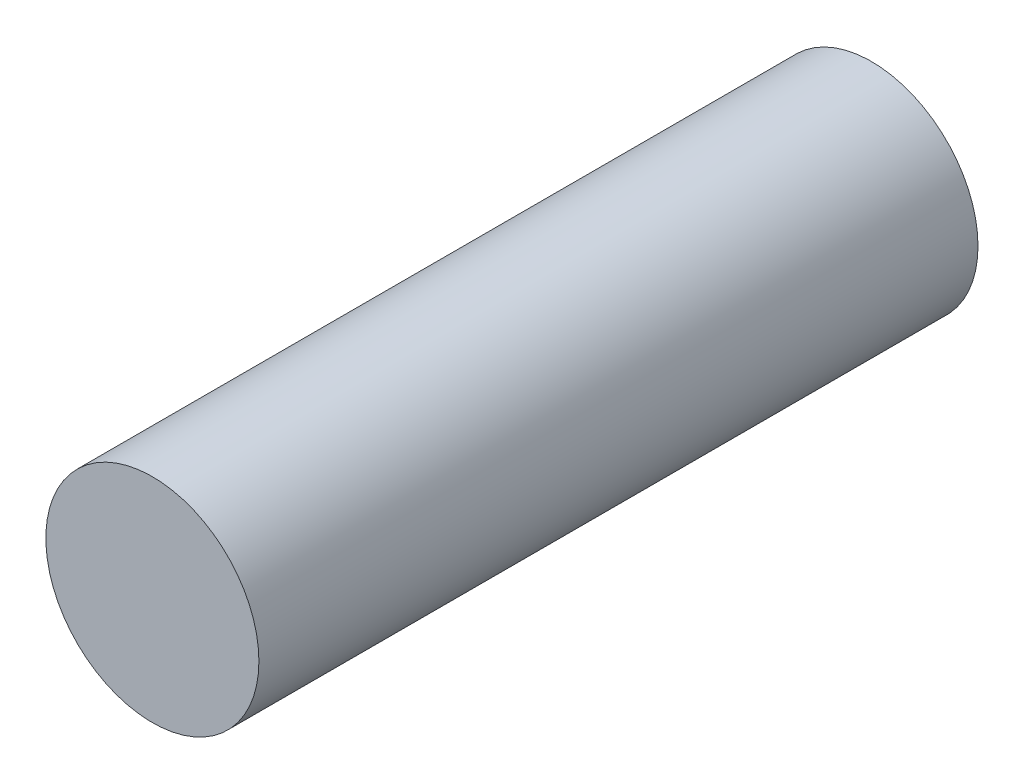
ISO-10303-21;
HEADER;
FILE_DESCRIPTION(('STEP AP214'),'2;1');
FILE_NAME('part.step','',(''),(''),'','','');
FILE_SCHEMA(('AUTOMOTIVE_DESIGN { 1 0 10303 214 1 1 1 1 }'));
ENDSEC;
DATA;
#1=APPLICATION_CONTEXT('core data for automotive mechanical design processes');
#2=APPLICATION_PROTOCOL_DEFINITION('international standard','automotive_design',2000,#1);
#3=PRODUCT_CONTEXT('',#1,'mechanical');
#4=PRODUCT('Part','Part','',(#3));
#5=PRODUCT_RELATED_PRODUCT_CATEGORY('part','',(#4));
#6=PRODUCT_DEFINITION_FORMATION('','',#4);
#7=PRODUCT_DEFINITION_CONTEXT('part definition',#1,'design');
#8=PRODUCT_DEFINITION('design','',#6,#7);
#9=PRODUCT_DEFINITION_SHAPE('','',#8);
#10=(LENGTH_UNIT() NAMED_UNIT(*) SI_UNIT(.MILLI.,.METRE.));
#11=(NAMED_UNIT(*) PLANE_ANGLE_UNIT() SI_UNIT($,.RADIAN.));
#12=(NAMED_UNIT(*) SI_UNIT($,.STERADIAN.) SOLID_ANGLE_UNIT());
#13=UNCERTAINTY_MEASURE_WITH_UNIT(LENGTH_MEASURE(1.E-05),#10,'distance_accuracy_value','');
#14=(GEOMETRIC_REPRESENTATION_CONTEXT(3) GLOBAL_UNCERTAINTY_ASSIGNED_CONTEXT((#13)) GLOBAL_UNIT_ASSIGNED_CONTEXT((#10,
#11,#12)) REPRESENTATION_CONTEXT('',''));
#15=CARTESIAN_POINT('',(0.,0.,0.));
#16=DIRECTION('',(0.,0.,1.));
#17=DIRECTION('',(1.,0.,0.));
#18=AXIS2_PLACEMENT_3D('',#15,#16,#17);
#19=CARTESIAN_POINT('',(0.,0.,13.5));
#20=DIRECTION('',(0.,0.,-1.));
#21=DIRECTION('',(-1.,0.,0.));
#22=AXIS2_PLACEMENT_3D('',#19,#20,#21);
#23=CYLINDRICAL_SURFACE('',#22,2.);
#24=CARTESIAN_POINT('',(0.,0.,13.5));
#25=DIRECTION('',(0.,0.,1.));
#26=DIRECTION('',(1.,0.,0.));
#27=AXIS2_PLACEMENT_3D('',#24,#25,#26);
#28=CIRCLE('',#27,2.);
#29=CARTESIAN_POINT('',(2.,0.,13.5));
#30=VERTEX_POINT('',#29);
#31=EDGE_CURVE('E10',#30,#30,#28,.T.);
#32=ORIENTED_EDGE('',*,*,#31,.F.);
#33=EDGE_LOOP('',(#32));
#34=FACE_BOUND('',#33,.T.);
#35=CARTESIAN_POINT('',(0.,0.,0.));
#36=DIRECTION('',(0.,0.,1.));
#37=DIRECTION('',(1.,0.,0.));
#38=AXIS2_PLACEMENT_3D('',#35,#36,#37);
#39=CIRCLE('',#38,2.);
#40=CARTESIAN_POINT('',(2.,0.,0.));
#41=VERTEX_POINT('',#40);
#42=EDGE_CURVE('E42',#41,#41,#39,.T.);
#43=ORIENTED_EDGE('',*,*,#42,.T.);
#44=EDGE_LOOP('',(#43));
#45=FACE_BOUND('',#44,.T.);
#46=ADVANCED_FACE('F39',(#34,#45),#23,.T.);
#47=CARTESIAN_POINT('',(0.,0.,13.5));
#48=DIRECTION('',(0.,0.,1.));
#49=DIRECTION('',(1.,0.,0.));
#50=AXIS2_PLACEMENT_3D('',#47,#48,#49);
#51=PLANE('',#50);
#52=ORIENTED_EDGE('',*,*,#31,.T.);
#53=EDGE_LOOP('',(#52));
#54=FACE_BOUND('',#53,.T.);
#55=ADVANCED_FACE('F56',(#54),#51,.T.);
#56=CARTESIAN_POINT('',(0.,0.,0.));
#57=DIRECTION('',(0.,0.,1.));
#58=DIRECTION('',(1.,0.,0.));
#59=AXIS2_PLACEMENT_3D('',#56,#57,#58);
#60=PLANE('',#59);
#61=ORIENTED_EDGE('',*,*,#42,.F.);
#62=EDGE_LOOP('',(#61));
#63=FACE_BOUND('',#62,.T.);
#64=ADVANCED_FACE('F54',(#63),#60,.F.);
#65=CLOSED_SHELL('',(#46,#55,#64));
#66=MANIFOLD_SOLID_BREP('B2',#65);
#67=ADVANCED_BREP_SHAPE_REPRESENTATION('',(#18,#66),#14);
#68=SHAPE_DEFINITION_REPRESENTATION(#9,#67);
ENDSEC;
END-ISO-10303-21;
